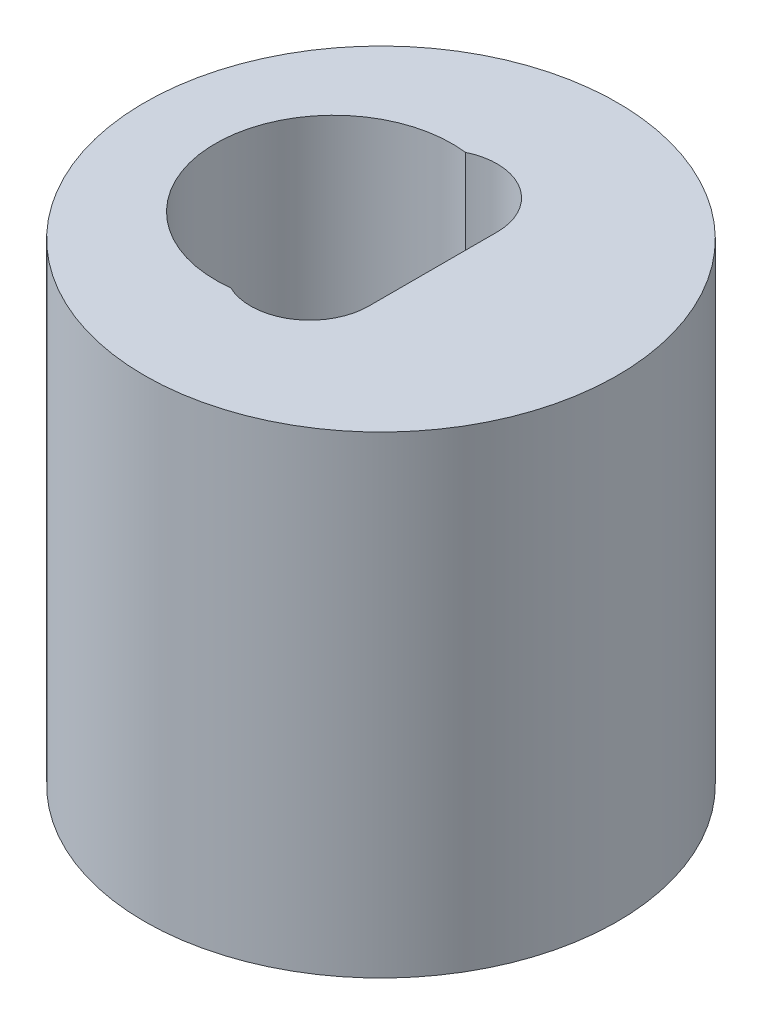
ISO-10303-21;
HEADER;
FILE_DESCRIPTION(('STEP AP214'),'2;1');
FILE_NAME('part.step','',(''),(''),'','','');
FILE_SCHEMA(('AUTOMOTIVE_DESIGN { 1 0 10303 214 1 1 1 1 }'));
ENDSEC;
DATA;
#1=APPLICATION_CONTEXT('core data for automotive mechanical design processes');
#2=APPLICATION_PROTOCOL_DEFINITION('international standard','automotive_design',2000,#1);
#3=PRODUCT_CONTEXT('',#1,'mechanical');
#4=PRODUCT('Part','Part','',(#3));
#5=PRODUCT_RELATED_PRODUCT_CATEGORY('part','',(#4));
#6=PRODUCT_DEFINITION_FORMATION('','',#4);
#7=PRODUCT_DEFINITION_CONTEXT('part definition',#1,'design');
#8=PRODUCT_DEFINITION('design','',#6,#7);
#9=PRODUCT_DEFINITION_SHAPE('','',#8);
#10=(LENGTH_UNIT() NAMED_UNIT(*) SI_UNIT(.MILLI.,.METRE.));
#11=(NAMED_UNIT(*) PLANE_ANGLE_UNIT() SI_UNIT($,.RADIAN.));
#12=(NAMED_UNIT(*) SI_UNIT($,.STERADIAN.) SOLID_ANGLE_UNIT());
#13=UNCERTAINTY_MEASURE_WITH_UNIT(LENGTH_MEASURE(1.E-05),#10,'distance_accuracy_value','');
#14=(GEOMETRIC_REPRESENTATION_CONTEXT(3) GLOBAL_UNCERTAINTY_ASSIGNED_CONTEXT((#13)) GLOBAL_UNIT_ASSIGNED_CONTEXT((#10,
#11,#12)) REPRESENTATION_CONTEXT('',''));
#15=CARTESIAN_POINT('',(0.,0.,0.));
#16=DIRECTION('',(0.,0.,1.));
#17=DIRECTION('',(1.,0.,0.));
#18=AXIS2_PLACEMENT_3D('',#15,#16,#17);
#19=CARTESIAN_POINT('',(0.,12.7,0.));
#20=DIRECTION('',(0.,1.,0.));
#21=DIRECTION('',(0.,0.,1.));
#22=AXIS2_PLACEMENT_3D('',#19,#20,#21);
#23=PLANE('',#22);
#24=CARTESIAN_POINT('',(-0.190499999999999,12.7,-1.72271181571382));
#25=DIRECTION('',(0.,1.,0.));
#26=DIRECTION('',(0.,0.,-1.));
#27=AXIS2_PLACEMENT_3D('',#24,#25,#26);
#28=CIRCLE('',#27,1.5875);
#29=CARTESIAN_POINT('',(1.397,12.7,-1.72271181571382));
#30=VERTEX_POINT('',#29);
#31=CARTESIAN_POINT('',(-0.88280487804878,12.7,-3.15130210191552));
#32=VERTEX_POINT('',#31);
#33=EDGE_CURVE('E76',#30,#32,#28,.T.);
#34=ORIENTED_EDGE('',*,*,#33,.F.);
#35=DIRECTION('',(0.,0.,-1.));
#36=VECTOR('',#35,1.);
#37=CARTESIAN_POINT('',(1.397,12.7,-1.72271181571382));
#38=LINE('',#37,#36);
#39=CARTESIAN_POINT('',(1.397,12.7,1.72271181571382));
#40=VERTEX_POINT('',#39);
#41=EDGE_CURVE('E100',#40,#30,#38,.T.);
#42=ORIENTED_EDGE('',*,*,#41,.F.);
#43=CARTESIAN_POINT('',(-0.190499999999999,12.7,1.72271181571382));
#44=DIRECTION('',(0.,1.,0.));
#45=DIRECTION('',(0.,0.,1.));
#46=AXIS2_PLACEMENT_3D('',#43,#44,#45);
#47=CIRCLE('',#46,1.5875);
#48=CARTESIAN_POINT('',(-0.88280487804878,12.7,3.15130210191552));
#49=VERTEX_POINT('',#48);
#50=EDGE_CURVE('E49',#49,#40,#47,.T.);
#51=ORIENTED_EDGE('',*,*,#50,.F.);
#52=CARTESIAN_POINT('',(-1.27,12.7,0.));
#53=DIRECTION('',(0.,1.,0.));
#54=DIRECTION('',(0.,0.,1.));
#55=AXIS2_PLACEMENT_3D('',#52,#53,#54);
#56=CIRCLE('',#55,3.175);
#57=EDGE_CURVE('E96',#32,#49,#56,.T.);
#58=ORIENTED_EDGE('',*,*,#57,.F.);
#59=EDGE_LOOP('',(#34,#42,#51,#58));
#60=FACE_BOUND('',#59,.T.);
#61=CARTESIAN_POINT('',(0.,12.7,0.));
#62=DIRECTION('',(0.,1.,0.));
#63=DIRECTION('',(0.,0.,1.));
#64=AXIS2_PLACEMENT_3D('',#61,#62,#63);
#65=CIRCLE('',#64,6.35);
#66=CARTESIAN_POINT('',(0.,12.7,6.35));
#67=VERTEX_POINT('',#66);
#68=EDGE_CURVE('E11',#67,#67,#65,.T.);
#69=ORIENTED_EDGE('',*,*,#68,.T.);
#70=EDGE_LOOP('',(#69));
#71=FACE_BOUND('',#70,.T.);
#72=ADVANCED_FACE('F34',(#60,#71),#23,.T.);
#73=CARTESIAN_POINT('',(0.,0.,0.));
#74=DIRECTION('',(0.,1.,0.));
#75=DIRECTION('',(0.,0.,1.));
#76=AXIS2_PLACEMENT_3D('',#73,#74,#75);
#77=PLANE('',#76);
#78=CARTESIAN_POINT('',(0.,0.,0.));
#79=DIRECTION('',(0.,1.,0.));
#80=DIRECTION('',(0.,0.,1.));
#81=AXIS2_PLACEMENT_3D('',#78,#79,#80);
#82=CIRCLE('',#81,6.35);
#83=CARTESIAN_POINT('',(0.,0.,6.35));
#84=VERTEX_POINT('',#83);
#85=EDGE_CURVE('E38',#84,#84,#82,.T.);
#86=ORIENTED_EDGE('',*,*,#85,.F.);
#87=EDGE_LOOP('',(#86));
#88=FACE_BOUND('',#87,.T.);
#89=DIRECTION('',(0.,0.,-1.));
#90=VECTOR('',#89,1.);
#91=CARTESIAN_POINT('',(1.397,0.,-1.72271181571382));
#92=LINE('',#91,#90);
#93=CARTESIAN_POINT('',(1.397,0.,1.72271181571382));
#94=VERTEX_POINT('',#93);
#95=CARTESIAN_POINT('',(1.397,0.,-1.72271181571382));
#96=VERTEX_POINT('',#95);
#97=EDGE_CURVE('E91',#94,#96,#92,.T.);
#98=ORIENTED_EDGE('',*,*,#97,.T.);
#99=CARTESIAN_POINT('',(-0.190499999999999,0.,-1.72271181571382));
#100=DIRECTION('',(0.,1.,0.));
#101=DIRECTION('',(0.,0.,-1.));
#102=AXIS2_PLACEMENT_3D('',#99,#100,#101);
#103=CIRCLE('',#102,1.5875);
#104=CARTESIAN_POINT('',(-0.88280487804878,0.,-3.15130210191552));
#105=VERTEX_POINT('',#104);
#106=EDGE_CURVE('E57',#96,#105,#103,.T.);
#107=ORIENTED_EDGE('',*,*,#106,.T.);
#108=CARTESIAN_POINT('',(-1.27,0.,0.));
#109=DIRECTION('',(0.,1.,0.));
#110=DIRECTION('',(0.,0.,1.));
#111=AXIS2_PLACEMENT_3D('',#108,#109,#110);
#112=CIRCLE('',#111,3.175);
#113=CARTESIAN_POINT('',(-0.88280487804878,0.,3.15130210191552));
#114=VERTEX_POINT('',#113);
#115=EDGE_CURVE('E89',#105,#114,#112,.T.);
#116=ORIENTED_EDGE('',*,*,#115,.T.);
#117=CARTESIAN_POINT('',(-0.190499999999999,0.,1.72271181571382));
#118=DIRECTION('',(0.,1.,0.));
#119=DIRECTION('',(0.,0.,1.));
#120=AXIS2_PLACEMENT_3D('',#117,#118,#119);
#121=CIRCLE('',#120,1.5875);
#122=EDGE_CURVE('E82',#114,#94,#121,.T.);
#123=ORIENTED_EDGE('',*,*,#122,.T.);
#124=EDGE_LOOP('',(#98,#107,#116,#123));
#125=FACE_BOUND('',#124,.T.);
#126=ADVANCED_FACE('F87',(#88,#125),#77,.F.);
#127=CARTESIAN_POINT('',(0.,12.7,0.));
#128=DIRECTION('',(0.,-1.,0.));
#129=DIRECTION('',(0.,0.,-1.));
#130=AXIS2_PLACEMENT_3D('',#127,#128,#129);
#131=CYLINDRICAL_SURFACE('',#130,6.35);
#132=ORIENTED_EDGE('',*,*,#68,.F.);
#133=EDGE_LOOP('',(#132));
#134=FACE_BOUND('',#133,.T.);
#135=ORIENTED_EDGE('',*,*,#85,.T.);
#136=EDGE_LOOP('',(#135));
#137=FACE_BOUND('',#136,.T.);
#138=ADVANCED_FACE('F36',(#134,#137),#131,.T.);
#139=CARTESIAN_POINT('',(-1.27,12.7,0.));
#140=DIRECTION('',(0.,-1.,0.));
#141=DIRECTION('',(0.,0.,-1.));
#142=AXIS2_PLACEMENT_3D('',#139,#140,#141);
#143=CYLINDRICAL_SURFACE('',#142,3.175);
#144=DIRECTION('',(0.,1.,0.));
#145=VECTOR('',#144,1.);
#146=CARTESIAN_POINT('',(-0.88280487804878,0.,-3.15130210191552));
#147=LINE('',#146,#145);
#148=EDGE_CURVE('E73',#105,#32,#147,.T.);
#149=ORIENTED_EDGE('',*,*,#148,.T.);
#150=ORIENTED_EDGE('',*,*,#57,.T.);
#151=DIRECTION('',(0.,1.,0.));
#152=VECTOR('',#151,1.);
#153=CARTESIAN_POINT('',(-0.88280487804878,0.,3.15130210191552));
#154=LINE('',#153,#152);
#155=EDGE_CURVE('E81',#114,#49,#154,.T.);
#156=ORIENTED_EDGE('',*,*,#155,.F.);
#157=ORIENTED_EDGE('',*,*,#115,.F.);
#158=EDGE_LOOP('',(#149,#150,#156,#157));
#159=FACE_BOUND('',#158,.T.);
#160=ADVANCED_FACE('F94',(#159),#143,.F.);
#161=CARTESIAN_POINT('',(1.397,12.7,-1.72271181571382));
#162=DIRECTION('',(-1.,0.,0.));
#163=DIRECTION('',(0.,0.,1.));
#164=AXIS2_PLACEMENT_3D('',#161,#162,#163);
#165=PLANE('',#164);
#166=ORIENTED_EDGE('',*,*,#97,.F.);
#167=DIRECTION('',(0.,-1.,0.));
#168=VECTOR('',#167,1.);
#169=CARTESIAN_POINT('',(1.397,12.7,1.72271181571382));
#170=LINE('',#169,#168);
#171=EDGE_CURVE('E105',#40,#94,#170,.T.);
#172=ORIENTED_EDGE('',*,*,#171,.F.);
#173=ORIENTED_EDGE('',*,*,#41,.T.);
#174=DIRECTION('',(0.,-1.,0.));
#175=VECTOR('',#174,1.);
#176=CARTESIAN_POINT('',(1.397,12.7,-1.72271181571382));
#177=LINE('',#176,#175);
#178=EDGE_CURVE('E103',#30,#96,#177,.T.);
#179=ORIENTED_EDGE('',*,*,#178,.T.);
#180=EDGE_LOOP('',(#166,#172,#173,#179));
#181=FACE_BOUND('',#180,.T.);
#182=ADVANCED_FACE('F121',(#181),#165,.T.);
#183=CARTESIAN_POINT('',(-0.190499999999999,0.,1.72271181571382));
#184=DIRECTION('',(0.,1.,0.));
#185=DIRECTION('',(0.,0.,1.));
#186=AXIS2_PLACEMENT_3D('',#183,#184,#185);
#187=CYLINDRICAL_SURFACE('',#186,1.5875);
#188=ORIENTED_EDGE('',*,*,#50,.T.);
#189=ORIENTED_EDGE('',*,*,#171,.T.);
#190=ORIENTED_EDGE('',*,*,#122,.F.);
#191=ORIENTED_EDGE('',*,*,#155,.T.);
#192=EDGE_LOOP('',(#188,#189,#190,#191));
#193=FACE_BOUND('',#192,.T.);
#194=ADVANCED_FACE('F124',(#193),#187,.F.);
#195=CARTESIAN_POINT('',(-0.190499999999999,0.,-1.72271181571382));
#196=DIRECTION('',(0.,1.,0.));
#197=DIRECTION('',(0.,0.,1.));
#198=AXIS2_PLACEMENT_3D('',#195,#196,#197);
#199=CYLINDRICAL_SURFACE('',#198,1.5875);
#200=ORIENTED_EDGE('',*,*,#33,.T.);
#201=ORIENTED_EDGE('',*,*,#148,.F.);
#202=ORIENTED_EDGE('',*,*,#106,.F.);
#203=ORIENTED_EDGE('',*,*,#178,.F.);
#204=EDGE_LOOP('',(#200,#201,#202,#203));
#205=FACE_BOUND('',#204,.T.);
#206=ADVANCED_FACE('F74',(#205),#199,.F.);
#207=CLOSED_SHELL('',(#72,#126,#138,#160,#182,#194,#206));
#208=MANIFOLD_SOLID_BREP('B2',#207);
#209=ADVANCED_BREP_SHAPE_REPRESENTATION('',(#18,#208),#14);
#210=SHAPE_DEFINITION_REPRESENTATION(#9,#209);
ENDSEC;
END-ISO-10303-21;
